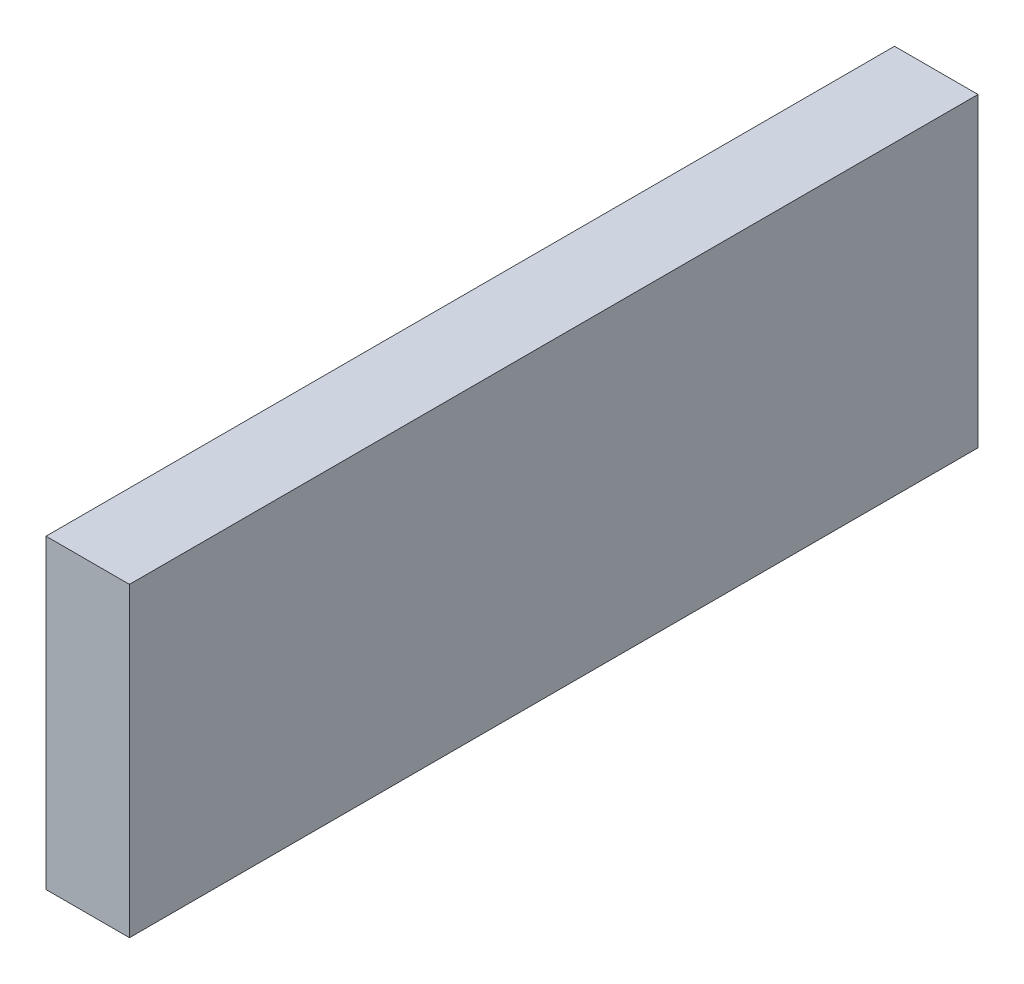
ISO-10303-21;
HEADER;
FILE_DESCRIPTION(('STEP AP214'),'2;1');
FILE_NAME('part.step','',(''),(''),'','','');
FILE_SCHEMA(('AUTOMOTIVE_DESIGN { 1 0 10303 214 1 1 1 1 }'));
ENDSEC;
DATA;
#1=APPLICATION_CONTEXT('core data for automotive mechanical design processes');
#2=APPLICATION_PROTOCOL_DEFINITION('international standard','automotive_design',2000,#1);
#3=PRODUCT_CONTEXT('',#1,'mechanical');
#4=PRODUCT('Part','Part','',(#3));
#5=PRODUCT_RELATED_PRODUCT_CATEGORY('part','',(#4));
#6=PRODUCT_DEFINITION_FORMATION('','',#4);
#7=PRODUCT_DEFINITION_CONTEXT('part definition',#1,'design');
#8=PRODUCT_DEFINITION('design','',#6,#7);
#9=PRODUCT_DEFINITION_SHAPE('','',#8);
#10=(LENGTH_UNIT() NAMED_UNIT(*) SI_UNIT(.MILLI.,.METRE.));
#11=(NAMED_UNIT(*) PLANE_ANGLE_UNIT() SI_UNIT($,.RADIAN.));
#12=(NAMED_UNIT(*) SI_UNIT($,.STERADIAN.) SOLID_ANGLE_UNIT());
#13=UNCERTAINTY_MEASURE_WITH_UNIT(LENGTH_MEASURE(1.E-05),#10,'distance_accuracy_value','');
#14=(GEOMETRIC_REPRESENTATION_CONTEXT(3) GLOBAL_UNCERTAINTY_ASSIGNED_CONTEXT((#13)) GLOBAL_UNIT_ASSIGNED_CONTEXT((#10,
#11,#12)) REPRESENTATION_CONTEXT('',''));
#15=CARTESIAN_POINT('',(0.,0.,0.));
#16=DIRECTION('',(0.,0.,1.));
#17=DIRECTION('',(1.,0.,0.));
#18=AXIS2_PLACEMENT_3D('',#15,#16,#17);
#19=CARTESIAN_POINT('',(19.05,-69.85,387.35));
#20=DIRECTION('',(-1.,0.,0.));
#21=DIRECTION('',(0.,0.,1.));
#22=AXIS2_PLACEMENT_3D('',#19,#20,#21);
#23=PLANE('',#22);
#24=DIRECTION('',(0.,1.,0.));
#25=VECTOR('',#24,1.);
#26=CARTESIAN_POINT('',(19.05,-69.85,0.));
#27=LINE('',#26,#25);
#28=CARTESIAN_POINT('',(19.05,-69.85,0.));
#29=VERTEX_POINT('',#28);
#30=CARTESIAN_POINT('',(19.05,69.85,0.));
#31=VERTEX_POINT('',#30);
#32=EDGE_CURVE('E96',#29,#31,#27,.T.);
#33=ORIENTED_EDGE('',*,*,#32,.T.);
#34=DIRECTION('',(0.,0.,-1.));
#35=VECTOR('',#34,1.);
#36=CARTESIAN_POINT('',(19.05,69.85,387.35));
#37=LINE('',#36,#35);
#38=CARTESIAN_POINT('',(19.05,69.85,387.35));
#39=VERTEX_POINT('',#38);
#40=EDGE_CURVE('E11',#39,#31,#37,.T.);
#41=ORIENTED_EDGE('',*,*,#40,.F.);
#42=DIRECTION('',(0.,1.,0.));
#43=VECTOR('',#42,1.);
#44=CARTESIAN_POINT('',(19.05,-69.85,387.35));
#45=LINE('',#44,#43);
#46=CARTESIAN_POINT('',(19.05,-69.85,387.35));
#47=VERTEX_POINT('',#46);
#48=EDGE_CURVE('E84',#47,#39,#45,.T.);
#49=ORIENTED_EDGE('',*,*,#48,.F.);
#50=DIRECTION('',(0.,0.,-1.));
#51=VECTOR('',#50,1.);
#52=CARTESIAN_POINT('',(19.05,-69.85,387.35));
#53=LINE('',#52,#51);
#54=EDGE_CURVE('E92',#47,#29,#53,.T.);
#55=ORIENTED_EDGE('',*,*,#54,.T.);
#56=EDGE_LOOP('',(#33,#41,#49,#55));
#57=FACE_BOUND('',#56,.T.);
#58=ADVANCED_FACE('F33',(#57),#23,.F.);
#59=CARTESIAN_POINT('',(-19.05,69.85,387.35));
#60=DIRECTION('',(0.,-1.,0.));
#61=DIRECTION('',(0.,0.,-1.));
#62=AXIS2_PLACEMENT_3D('',#59,#60,#61);
#63=PLANE('',#62);
#64=DIRECTION('',(-1.,0.,0.));
#65=VECTOR('',#64,1.);
#66=CARTESIAN_POINT('',(-19.05,69.85,0.));
#67=LINE('',#66,#65);
#68=CARTESIAN_POINT('',(-19.05,69.85,0.));
#69=VERTEX_POINT('',#68);
#70=EDGE_CURVE('E88',#31,#69,#67,.T.);
#71=ORIENTED_EDGE('',*,*,#70,.T.);
#72=DIRECTION('',(0.,0.,-1.));
#73=VECTOR('',#72,1.);
#74=CARTESIAN_POINT('',(-19.05,69.85,387.35));
#75=LINE('',#74,#73);
#76=CARTESIAN_POINT('',(-19.05,69.85,387.35));
#77=VERTEX_POINT('',#76);
#78=EDGE_CURVE('E41',#77,#69,#75,.T.);
#79=ORIENTED_EDGE('',*,*,#78,.F.);
#80=DIRECTION('',(-1.,0.,0.));
#81=VECTOR('',#80,1.);
#82=CARTESIAN_POINT('',(-19.05,69.85,387.35));
#83=LINE('',#82,#81);
#84=EDGE_CURVE('E79',#39,#77,#83,.T.);
#85=ORIENTED_EDGE('',*,*,#84,.F.);
#86=ORIENTED_EDGE('',*,*,#40,.T.);
#87=EDGE_LOOP('',(#71,#79,#85,#86));
#88=FACE_BOUND('',#87,.T.);
#89=ADVANCED_FACE('F87',(#88),#63,.F.);
#90=CARTESIAN_POINT('',(-19.05,-69.85,387.35));
#91=DIRECTION('',(1.,0.,0.));
#92=DIRECTION('',(0.,0.,-1.));
#93=AXIS2_PLACEMENT_3D('',#90,#91,#92);
#94=PLANE('',#93);
#95=DIRECTION('',(0.,-1.,0.));
#96=VECTOR('',#95,1.);
#97=CARTESIAN_POINT('',(-19.05,-69.85,0.));
#98=LINE('',#97,#96);
#99=CARTESIAN_POINT('',(-19.05,-69.85,0.));
#100=VERTEX_POINT('',#99);
#101=EDGE_CURVE('E66',#69,#100,#98,.T.);
#102=ORIENTED_EDGE('',*,*,#101,.T.);
#103=DIRECTION('',(0.,0.,-1.));
#104=VECTOR('',#103,1.);
#105=CARTESIAN_POINT('',(-19.05,-69.85,387.35));
#106=LINE('',#105,#104);
#107=CARTESIAN_POINT('',(-19.05,-69.85,387.35));
#108=VERTEX_POINT('',#107);
#109=EDGE_CURVE('E89',#108,#100,#106,.T.);
#110=ORIENTED_EDGE('',*,*,#109,.F.);
#111=DIRECTION('',(0.,-1.,0.));
#112=VECTOR('',#111,1.);
#113=CARTESIAN_POINT('',(-19.05,-69.85,387.35));
#114=LINE('',#113,#112);
#115=EDGE_CURVE('E82',#77,#108,#114,.T.);
#116=ORIENTED_EDGE('',*,*,#115,.F.);
#117=ORIENTED_EDGE('',*,*,#78,.T.);
#118=EDGE_LOOP('',(#102,#110,#116,#117));
#119=FACE_BOUND('',#118,.T.);
#120=ADVANCED_FACE('F90',(#119),#94,.F.);
#121=CARTESIAN_POINT('',(-19.05,-69.85,387.35));
#122=DIRECTION('',(0.,1.,0.));
#123=DIRECTION('',(0.,0.,1.));
#124=AXIS2_PLACEMENT_3D('',#121,#122,#123);
#125=PLANE('',#124);
#126=DIRECTION('',(1.,0.,0.));
#127=VECTOR('',#126,1.);
#128=CARTESIAN_POINT('',(-19.05,-69.85,0.));
#129=LINE('',#128,#127);
#130=EDGE_CURVE('E72',#100,#29,#129,.T.);
#131=ORIENTED_EDGE('',*,*,#130,.T.);
#132=ORIENTED_EDGE('',*,*,#54,.F.);
#133=DIRECTION('',(1.,0.,0.));
#134=VECTOR('',#133,1.);
#135=CARTESIAN_POINT('',(-19.05,-69.85,387.35));
#136=LINE('',#135,#134);
#137=EDGE_CURVE('E49',#108,#47,#136,.T.);
#138=ORIENTED_EDGE('',*,*,#137,.F.);
#139=ORIENTED_EDGE('',*,*,#109,.T.);
#140=EDGE_LOOP('',(#131,#132,#138,#139));
#141=FACE_BOUND('',#140,.T.);
#142=ADVANCED_FACE('F103',(#141),#125,.F.);
#143=CARTESIAN_POINT('',(0.,0.,387.35));
#144=DIRECTION('',(0.,0.,-1.));
#145=DIRECTION('',(-1.,0.,0.));
#146=AXIS2_PLACEMENT_3D('',#143,#144,#145);
#147=PLANE('',#146);
#148=ORIENTED_EDGE('',*,*,#48,.T.);
#149=ORIENTED_EDGE('',*,*,#84,.T.);
#150=ORIENTED_EDGE('',*,*,#115,.T.);
#151=ORIENTED_EDGE('',*,*,#137,.T.);
#152=EDGE_LOOP('',(#148,#149,#150,#151));
#153=FACE_BOUND('',#152,.T.);
#154=ADVANCED_FACE('F80',(#153),#147,.F.);
#155=CARTESIAN_POINT('',(0.,0.,0.));
#156=DIRECTION('',(0.,0.,-1.));
#157=DIRECTION('',(-1.,0.,0.));
#158=AXIS2_PLACEMENT_3D('',#155,#156,#157);
#159=PLANE('',#158);
#160=ORIENTED_EDGE('',*,*,#32,.F.);
#161=ORIENTED_EDGE('',*,*,#130,.F.);
#162=ORIENTED_EDGE('',*,*,#101,.F.);
#163=ORIENTED_EDGE('',*,*,#70,.F.);
#164=EDGE_LOOP('',(#160,#161,#162,#163));
#165=FACE_BOUND('',#164,.T.);
#166=ADVANCED_FACE('F106',(#165),#159,.T.);
#167=CLOSED_SHELL('',(#58,#89,#120,#142,#154,#166));
#168=MANIFOLD_SOLID_BREP('B2',#167);
#169=ADVANCED_BREP_SHAPE_REPRESENTATION('',(#18,#168),#14);
#170=SHAPE_DEFINITION_REPRESENTATION(#9,#169);
ENDSEC;
END-ISO-10303-21;
